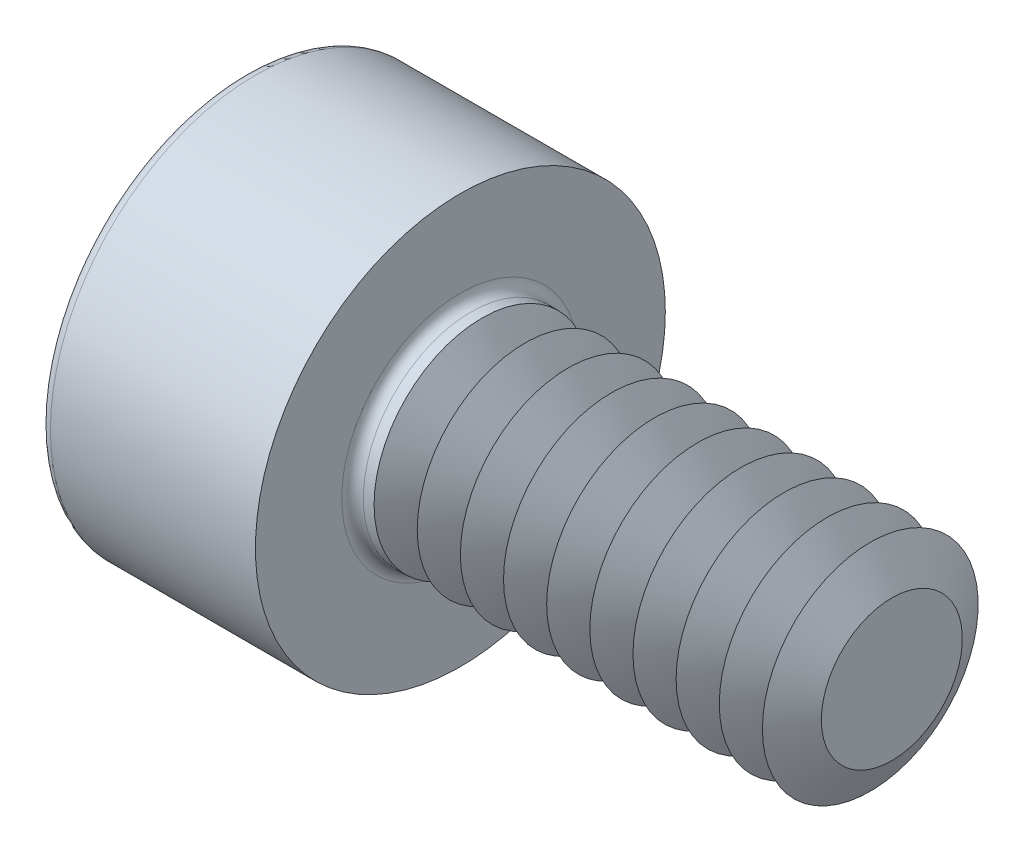
ISO-10303-21;
HEADER;
FILE_DESCRIPTION(('STEP AP214'),'2;1');
FILE_NAME('part.step','',(''),(''),'','','');
FILE_SCHEMA(('AUTOMOTIVE_DESIGN { 1 0 10303 214 1 1 1 1 }'));
ENDSEC;
DATA;
#1=APPLICATION_CONTEXT('core data for automotive mechanical design processes');
#2=APPLICATION_PROTOCOL_DEFINITION('international standard','automotive_design',2000,#1);
#3=PRODUCT_CONTEXT('',#1,'mechanical');
#4=PRODUCT('Part','Part','',(#3));
#5=PRODUCT_RELATED_PRODUCT_CATEGORY('part','',(#4));
#6=PRODUCT_DEFINITION_FORMATION('','',#4);
#7=PRODUCT_DEFINITION_CONTEXT('part definition',#1,'design');
#8=PRODUCT_DEFINITION('design','',#6,#7);
#9=PRODUCT_DEFINITION_SHAPE('','',#8);
#10=(LENGTH_UNIT() NAMED_UNIT(*) SI_UNIT(.MILLI.,.METRE.));
#11=(NAMED_UNIT(*) PLANE_ANGLE_UNIT() SI_UNIT($,.RADIAN.));
#12=(NAMED_UNIT(*) SI_UNIT($,.STERADIAN.) SOLID_ANGLE_UNIT());
#13=UNCERTAINTY_MEASURE_WITH_UNIT(LENGTH_MEASURE(1.E-05),#10,'distance_accuracy_value','');
#14=(GEOMETRIC_REPRESENTATION_CONTEXT(3) GLOBAL_UNCERTAINTY_ASSIGNED_CONTEXT((#13)) GLOBAL_UNIT_ASSIGNED_CONTEXT((#10,
#11,#12)) REPRESENTATION_CONTEXT('',''));
#15=CARTESIAN_POINT('',(0.,0.,0.));
#16=DIRECTION('',(0.,0.,1.));
#17=DIRECTION('',(1.,0.,0.));
#18=AXIS2_PLACEMENT_3D('',#15,#16,#17);
#19=CARTESIAN_POINT('',(4.2,0.,0.));
#20=DIRECTION('',(-1.,0.,0.));
#21=DIRECTION('',(0.,0.,1.));
#22=AXIS2_PLACEMENT_3D('',#19,#20,#21);
#23=CONICAL_SURFACE('',#22,1.,1.04718484902493);
#24=CARTESIAN_POINT('',(4.4,0.,0.));
#25=DIRECTION('',(-1.,0.,0.));
#26=DIRECTION('',(0.,0.,1.));
#27=AXIS2_PLACEMENT_3D('',#24,#25,#26);
#28=CIRCLE('',#27,0.6536);
#29=CARTESIAN_POINT('',(4.4,0.,0.6536));
#30=VERTEX_POINT('',#29);
#31=EDGE_CURVE('E308',#30,#30,#28,.T.);
#32=ORIENTED_EDGE('',*,*,#31,.T.);
#33=EDGE_LOOP('',(#32));
#34=FACE_BOUND('',#33,.T.);
#35=CARTESIAN_POINT('',(4.2,0.,0.));
#36=DIRECTION('',(-1.,0.,0.));
#37=DIRECTION('',(0.,0.,1.));
#38=AXIS2_PLACEMENT_3D('',#35,#36,#37);
#39=CIRCLE('',#38,1.);
#40=CARTESIAN_POINT('',(4.2,0.,1.));
#41=VERTEX_POINT('',#40);
#42=EDGE_CURVE('E299',#41,#41,#39,.T.);
#43=ORIENTED_EDGE('',*,*,#42,.F.);
#44=EDGE_LOOP('',(#43));
#45=FACE_BOUND('',#44,.T.);
#46=ADVANCED_FACE('F47',(#34,#45),#23,.T.);
#47=CARTESIAN_POINT('',(4.4,0.,0.));
#48=DIRECTION('',(1.,0.,0.));
#49=DIRECTION('',(0.,0.,-1.));
#50=AXIS2_PLACEMENT_3D('',#47,#48,#49);
#51=CONICAL_SURFACE('',#50,0.6536,1.04718484902493);
#52=CARTESIAN_POINT('',(4.6,0.,0.));
#53=DIRECTION('',(-1.,0.,0.));
#54=DIRECTION('',(0.,0.,1.));
#55=AXIS2_PLACEMENT_3D('',#52,#53,#54);
#56=CIRCLE('',#55,1.);
#57=CARTESIAN_POINT('',(4.6,0.,1.));
#58=VERTEX_POINT('',#57);
#59=EDGE_CURVE('E304',#58,#58,#56,.T.);
#60=ORIENTED_EDGE('',*,*,#59,.T.);
#61=EDGE_LOOP('',(#60));
#62=FACE_BOUND('',#61,.T.);
#63=ORIENTED_EDGE('',*,*,#31,.F.);
#64=EDGE_LOOP('',(#63));
#65=FACE_BOUND('',#64,.T.);
#66=ADVANCED_FACE('F187',(#62,#65),#51,.T.);
#67=CARTESIAN_POINT('',(6.,1.,0.));
#68=DIRECTION('',(1.,0.,0.));
#69=DIRECTION('',(0.,0.,-1.));
#70=AXIS2_PLACEMENT_3D('',#67,#68,#69);
#71=PLANE('',#70);
#72=CARTESIAN_POINT('',(6.,0.,0.));
#73=DIRECTION('',(-1.,0.,0.));
#74=DIRECTION('',(0.,0.,1.));
#75=AXIS2_PLACEMENT_3D('',#72,#73,#74);
#76=CIRCLE('',#75,0.6536);
#77=CARTESIAN_POINT('',(6.,0.,0.6536));
#78=VERTEX_POINT('',#77);
#79=EDGE_CURVE('E137',#78,#78,#76,.T.);
#80=ORIENTED_EDGE('',*,*,#79,.F.);
#81=EDGE_LOOP('',(#80));
#82=FACE_BOUND('',#81,.T.);
#83=ADVANCED_FACE('F192',(#82),#71,.T.);
#84=CARTESIAN_POINT('',(5.8,0.,0.));
#85=DIRECTION('',(-1.,0.,0.));
#86=DIRECTION('',(0.,0.,1.));
#87=AXIS2_PLACEMENT_3D('',#84,#85,#86);
#88=CONICAL_SURFACE('',#87,1.,1.04718484902493);
#89=ORIENTED_EDGE('',*,*,#79,.T.);
#90=EDGE_LOOP('',(#89));
#91=FACE_BOUND('',#90,.T.);
#92=CARTESIAN_POINT('',(5.8,0.,0.));
#93=DIRECTION('',(-1.,0.,0.));
#94=DIRECTION('',(0.,0.,1.));
#95=AXIS2_PLACEMENT_3D('',#92,#93,#94);
#96=CIRCLE('',#95,1.);
#97=CARTESIAN_POINT('',(5.8,0.,1.));
#98=VERTEX_POINT('',#97);
#99=EDGE_CURVE('E325',#98,#98,#96,.T.);
#100=ORIENTED_EDGE('',*,*,#99,.F.);
#101=EDGE_LOOP('',(#100));
#102=FACE_BOUND('',#101,.T.);
#103=ADVANCED_FACE('F222',(#91,#102),#88,.T.);
#104=CARTESIAN_POINT('',(5.6,0.,0.));
#105=DIRECTION('',(1.,0.,0.));
#106=DIRECTION('',(0.,0.,-1.));
#107=AXIS2_PLACEMENT_3D('',#104,#105,#106);
#108=CONICAL_SURFACE('',#107,0.6536,1.04718484902493);
#109=ORIENTED_EDGE('',*,*,#99,.T.);
#110=EDGE_LOOP('',(#109));
#111=FACE_BOUND('',#110,.T.);
#112=CARTESIAN_POINT('',(5.6,0.,0.));
#113=DIRECTION('',(-1.,0.,0.));
#114=DIRECTION('',(0.,0.,1.));
#115=AXIS2_PLACEMENT_3D('',#112,#113,#114);
#116=CIRCLE('',#115,0.6536);
#117=CARTESIAN_POINT('',(5.6,0.,0.6536));
#118=VERTEX_POINT('',#117);
#119=EDGE_CURVE('E324',#118,#118,#116,.T.);
#120=ORIENTED_EDGE('',*,*,#119,.F.);
#121=EDGE_LOOP('',(#120));
#122=FACE_BOUND('',#121,.T.);
#123=ADVANCED_FACE('F218',(#111,#122),#108,.T.);
#124=CARTESIAN_POINT('',(5.4,0.,0.));
#125=DIRECTION('',(-1.,0.,0.));
#126=DIRECTION('',(0.,0.,1.));
#127=AXIS2_PLACEMENT_3D('',#124,#125,#126);
#128=CONICAL_SURFACE('',#127,1.,1.04718484902493);
#129=ORIENTED_EDGE('',*,*,#119,.T.);
#130=EDGE_LOOP('',(#129));
#131=FACE_BOUND('',#130,.T.);
#132=CARTESIAN_POINT('',(5.4,0.,0.));
#133=DIRECTION('',(-1.,0.,0.));
#134=DIRECTION('',(0.,0.,1.));
#135=AXIS2_PLACEMENT_3D('',#132,#133,#134);
#136=CIRCLE('',#135,1.);
#137=CARTESIAN_POINT('',(5.4,0.,1.));
#138=VERTEX_POINT('',#137);
#139=EDGE_CURVE('E317',#138,#138,#136,.T.);
#140=ORIENTED_EDGE('',*,*,#139,.F.);
#141=EDGE_LOOP('',(#140));
#142=FACE_BOUND('',#141,.T.);
#143=ADVANCED_FACE('F212',(#131,#142),#128,.T.);
#144=CARTESIAN_POINT('',(5.2,0.,0.));
#145=DIRECTION('',(1.,0.,0.));
#146=DIRECTION('',(0.,0.,-1.));
#147=AXIS2_PLACEMENT_3D('',#144,#145,#146);
#148=CONICAL_SURFACE('',#147,0.6536,1.04718484902493);
#149=ORIENTED_EDGE('',*,*,#139,.T.);
#150=EDGE_LOOP('',(#149));
#151=FACE_BOUND('',#150,.T.);
#152=CARTESIAN_POINT('',(5.2,0.,0.));
#153=DIRECTION('',(-1.,0.,0.));
#154=DIRECTION('',(0.,0.,1.));
#155=AXIS2_PLACEMENT_3D('',#152,#153,#154);
#156=CIRCLE('',#155,0.6536);
#157=CARTESIAN_POINT('',(5.2,0.,0.6536));
#158=VERTEX_POINT('',#157);
#159=EDGE_CURVE('E316',#158,#158,#156,.T.);
#160=ORIENTED_EDGE('',*,*,#159,.F.);
#161=EDGE_LOOP('',(#160));
#162=FACE_BOUND('',#161,.T.);
#163=ADVANCED_FACE('F208',(#151,#162),#148,.T.);
#164=CARTESIAN_POINT('',(5.,0.,0.));
#165=DIRECTION('',(-1.,0.,0.));
#166=DIRECTION('',(0.,0.,1.));
#167=AXIS2_PLACEMENT_3D('',#164,#165,#166);
#168=CONICAL_SURFACE('',#167,1.,1.04718484902493);
#169=ORIENTED_EDGE('',*,*,#159,.T.);
#170=EDGE_LOOP('',(#169));
#171=FACE_BOUND('',#170,.T.);
#172=CARTESIAN_POINT('',(5.,0.,0.));
#173=DIRECTION('',(-1.,0.,0.));
#174=DIRECTION('',(0.,0.,1.));
#175=AXIS2_PLACEMENT_3D('',#172,#173,#174);
#176=CIRCLE('',#175,1.);
#177=CARTESIAN_POINT('',(5.,0.,1.));
#178=VERTEX_POINT('',#177);
#179=EDGE_CURVE('E309',#178,#178,#176,.T.);
#180=ORIENTED_EDGE('',*,*,#179,.F.);
#181=EDGE_LOOP('',(#180));
#182=FACE_BOUND('',#181,.T.);
#183=ADVANCED_FACE('F202',(#171,#182),#168,.T.);
#184=CARTESIAN_POINT('',(4.8,0.,0.));
#185=DIRECTION('',(1.,0.,0.));
#186=DIRECTION('',(0.,0.,-1.));
#187=AXIS2_PLACEMENT_3D('',#184,#185,#186);
#188=CONICAL_SURFACE('',#187,0.6536,1.04718484902493);
#189=ORIENTED_EDGE('',*,*,#179,.T.);
#190=EDGE_LOOP('',(#189));
#191=FACE_BOUND('',#190,.T.);
#192=CARTESIAN_POINT('',(4.8,0.,0.));
#193=DIRECTION('',(-1.,0.,0.));
#194=DIRECTION('',(0.,0.,1.));
#195=AXIS2_PLACEMENT_3D('',#192,#193,#194);
#196=CIRCLE('',#195,0.6536);
#197=CARTESIAN_POINT('',(4.8,0.,0.6536));
#198=VERTEX_POINT('',#197);
#199=EDGE_CURVE('E312',#198,#198,#196,.T.);
#200=ORIENTED_EDGE('',*,*,#199,.F.);
#201=EDGE_LOOP('',(#200));
#202=FACE_BOUND('',#201,.T.);
#203=ADVANCED_FACE('F196',(#191,#202),#188,.T.);
#204=CARTESIAN_POINT('',(4.6,0.,0.));
#205=DIRECTION('',(-1.,0.,0.));
#206=DIRECTION('',(0.,0.,1.));
#207=AXIS2_PLACEMENT_3D('',#204,#205,#206);
#208=CONICAL_SURFACE('',#207,1.,1.04718484902493);
#209=ORIENTED_EDGE('',*,*,#199,.T.);
#210=EDGE_LOOP('',(#209));
#211=FACE_BOUND('',#210,.T.);
#212=ORIENTED_EDGE('',*,*,#59,.F.);
#213=EDGE_LOOP('',(#212));
#214=FACE_BOUND('',#213,.T.);
#215=ADVANCED_FACE('F201',(#211,#214),#208,.T.);
#216=CARTESIAN_POINT('',(3.8,0.,0.));
#217=DIRECTION('',(-1.,0.,0.));
#218=DIRECTION('',(0.,0.,1.));
#219=AXIS2_PLACEMENT_3D('',#216,#217,#218);
#220=CONICAL_SURFACE('',#219,1.,1.04718484902493);
#221=CARTESIAN_POINT('',(4.,0.,0.));
#222=DIRECTION('',(-1.,0.,0.));
#223=DIRECTION('',(0.,0.,1.));
#224=AXIS2_PLACEMENT_3D('',#221,#222,#223);
#225=CIRCLE('',#224,0.6536);
#226=CARTESIAN_POINT('',(4.,0.,0.6536));
#227=VERTEX_POINT('',#226);
#228=EDGE_CURVE('E305',#227,#227,#225,.T.);
#229=ORIENTED_EDGE('',*,*,#228,.T.);
#230=EDGE_LOOP('',(#229));
#231=FACE_BOUND('',#230,.T.);
#232=CARTESIAN_POINT('',(3.8,0.,0.));
#233=DIRECTION('',(-1.,0.,0.));
#234=DIRECTION('',(0.,0.,1.));
#235=AXIS2_PLACEMENT_3D('',#232,#233,#234);
#236=CIRCLE('',#235,1.);
#237=CARTESIAN_POINT('',(3.8,0.,1.));
#238=VERTEX_POINT('',#237);
#239=EDGE_CURVE('E291',#238,#238,#236,.T.);
#240=ORIENTED_EDGE('',*,*,#239,.F.);
#241=EDGE_LOOP('',(#240));
#242=FACE_BOUND('',#241,.T.);
#243=ADVANCED_FACE('F206',(#231,#242),#220,.T.);
#244=CARTESIAN_POINT('',(4.,0.,0.));
#245=DIRECTION('',(1.,0.,0.));
#246=DIRECTION('',(0.,0.,-1.));
#247=AXIS2_PLACEMENT_3D('',#244,#245,#246);
#248=CONICAL_SURFACE('',#247,0.6536,1.04718484902493);
#249=ORIENTED_EDGE('',*,*,#42,.T.);
#250=EDGE_LOOP('',(#249));
#251=FACE_BOUND('',#250,.T.);
#252=ORIENTED_EDGE('',*,*,#228,.F.);
#253=EDGE_LOOP('',(#252));
#254=FACE_BOUND('',#253,.T.);
#255=ADVANCED_FACE('F446',(#251,#254),#248,.T.);
#256=CARTESIAN_POINT('',(3.4,0.,0.));
#257=DIRECTION('',(-1.,0.,0.));
#258=DIRECTION('',(0.,0.,1.));
#259=AXIS2_PLACEMENT_3D('',#256,#257,#258);
#260=CONICAL_SURFACE('',#259,1.,1.04718484902493);
#261=CARTESIAN_POINT('',(3.6,0.,0.));
#262=DIRECTION('',(-1.,0.,0.));
#263=DIRECTION('',(0.,0.,1.));
#264=AXIS2_PLACEMENT_3D('',#261,#262,#263);
#265=CIRCLE('',#264,0.6536);
#266=CARTESIAN_POINT('',(3.6,0.,0.6536));
#267=VERTEX_POINT('',#266);
#268=EDGE_CURVE('E298',#267,#267,#265,.T.);
#269=ORIENTED_EDGE('',*,*,#268,.T.);
#270=EDGE_LOOP('',(#269));
#271=FACE_BOUND('',#270,.T.);
#272=CARTESIAN_POINT('',(3.4,0.,0.));
#273=DIRECTION('',(-1.,0.,0.));
#274=DIRECTION('',(0.,0.,1.));
#275=AXIS2_PLACEMENT_3D('',#272,#273,#274);
#276=CIRCLE('',#275,1.);
#277=CARTESIAN_POINT('',(3.4,0.,1.));
#278=VERTEX_POINT('',#277);
#279=EDGE_CURVE('E289',#278,#278,#276,.T.);
#280=ORIENTED_EDGE('',*,*,#279,.F.);
#281=EDGE_LOOP('',(#280));
#282=FACE_BOUND('',#281,.T.);
#283=ADVANCED_FACE('F439',(#271,#282),#260,.T.);
#284=CARTESIAN_POINT('',(3.6,0.,0.));
#285=DIRECTION('',(1.,0.,0.));
#286=DIRECTION('',(0.,0.,-1.));
#287=AXIS2_PLACEMENT_3D('',#284,#285,#286);
#288=CONICAL_SURFACE('',#287,0.6536,1.04718484902493);
#289=ORIENTED_EDGE('',*,*,#239,.T.);
#290=EDGE_LOOP('',(#289));
#291=FACE_BOUND('',#290,.T.);
#292=ORIENTED_EDGE('',*,*,#268,.F.);
#293=EDGE_LOOP('',(#292));
#294=FACE_BOUND('',#293,.T.);
#295=ADVANCED_FACE('F431',(#291,#294),#288,.T.);
#296=CARTESIAN_POINT('',(3.,0.,0.));
#297=DIRECTION('',(-1.,0.,0.));
#298=DIRECTION('',(0.,0.,1.));
#299=AXIS2_PLACEMENT_3D('',#296,#297,#298);
#300=CONICAL_SURFACE('',#299,1.,1.04718484902493);
#301=CARTESIAN_POINT('',(3.2,0.,0.));
#302=DIRECTION('',(-1.,0.,0.));
#303=DIRECTION('',(0.,0.,1.));
#304=AXIS2_PLACEMENT_3D('',#301,#302,#303);
#305=CIRCLE('',#304,0.6536);
#306=CARTESIAN_POINT('',(3.2,0.,0.6536));
#307=VERTEX_POINT('',#306);
#308=EDGE_CURVE('E288',#307,#307,#305,.T.);
#309=ORIENTED_EDGE('',*,*,#308,.T.);
#310=EDGE_LOOP('',(#309));
#311=FACE_BOUND('',#310,.T.);
#312=CARTESIAN_POINT('',(3.,0.,0.));
#313=DIRECTION('',(-1.,0.,0.));
#314=DIRECTION('',(0.,0.,1.));
#315=AXIS2_PLACEMENT_3D('',#312,#313,#314);
#316=CIRCLE('',#315,1.);
#317=CARTESIAN_POINT('',(3.,0.,1.));
#318=VERTEX_POINT('',#317);
#319=EDGE_CURVE('E282',#318,#318,#316,.T.);
#320=ORIENTED_EDGE('',*,*,#319,.F.);
#321=EDGE_LOOP('',(#320));
#322=FACE_BOUND('',#321,.T.);
#323=ADVANCED_FACE('F422',(#311,#322),#300,.T.);
#324=CARTESIAN_POINT('',(3.2,0.,0.));
#325=DIRECTION('',(1.,0.,0.));
#326=DIRECTION('',(0.,0.,-1.));
#327=AXIS2_PLACEMENT_3D('',#324,#325,#326);
#328=CONICAL_SURFACE('',#327,0.6536,1.04718484902493);
#329=ORIENTED_EDGE('',*,*,#279,.T.);
#330=EDGE_LOOP('',(#329));
#331=FACE_BOUND('',#330,.T.);
#332=ORIENTED_EDGE('',*,*,#308,.F.);
#333=EDGE_LOOP('',(#332));
#334=FACE_BOUND('',#333,.T.);
#335=ADVANCED_FACE('F413',(#331,#334),#328,.T.);
#336=CARTESIAN_POINT('',(2.6,0.,0.));
#337=DIRECTION('',(-1.,0.,0.));
#338=DIRECTION('',(0.,0.,1.));
#339=AXIS2_PLACEMENT_3D('',#336,#337,#338);
#340=CONICAL_SURFACE('',#339,1.,1.04718484902493);
#341=CARTESIAN_POINT('',(2.8,0.,0.));
#342=DIRECTION('',(-1.,0.,0.));
#343=DIRECTION('',(0.,0.,1.));
#344=AXIS2_PLACEMENT_3D('',#341,#342,#343);
#345=CIRCLE('',#344,0.6536);
#346=CARTESIAN_POINT('',(2.8,0.,0.6536));
#347=VERTEX_POINT('',#346);
#348=EDGE_CURVE('E284',#347,#347,#345,.T.);
#349=ORIENTED_EDGE('',*,*,#348,.T.);
#350=EDGE_LOOP('',(#349));
#351=FACE_BOUND('',#350,.T.);
#352=CARTESIAN_POINT('',(2.6,0.,0.));
#353=DIRECTION('',(-1.,0.,0.));
#354=DIRECTION('',(0.,0.,1.));
#355=AXIS2_PLACEMENT_3D('',#352,#353,#354);
#356=CIRCLE('',#355,1.);
#357=CARTESIAN_POINT('',(2.6,0.,1.));
#358=VERTEX_POINT('',#357);
#359=EDGE_CURVE('E271',#358,#358,#356,.T.);
#360=ORIENTED_EDGE('',*,*,#359,.F.);
#361=EDGE_LOOP('',(#360));
#362=FACE_BOUND('',#361,.T.);
#363=ADVANCED_FACE('F404',(#351,#362),#340,.T.);
#364=CARTESIAN_POINT('',(2.8,0.,0.));
#365=DIRECTION('',(1.,0.,0.));
#366=DIRECTION('',(0.,0.,-1.));
#367=AXIS2_PLACEMENT_3D('',#364,#365,#366);
#368=CONICAL_SURFACE('',#367,0.6536,1.04718484902493);
#369=ORIENTED_EDGE('',*,*,#319,.T.);
#370=EDGE_LOOP('',(#369));
#371=FACE_BOUND('',#370,.T.);
#372=ORIENTED_EDGE('',*,*,#348,.F.);
#373=EDGE_LOOP('',(#372));
#374=FACE_BOUND('',#373,.T.);
#375=ADVANCED_FACE('F391',(#371,#374),#368,.T.);
#376=CARTESIAN_POINT('',(2.2,0.,0.));
#377=DIRECTION('',(-1.,0.,0.));
#378=DIRECTION('',(0.,0.,1.));
#379=AXIS2_PLACEMENT_3D('',#376,#377,#378);
#380=CONICAL_SURFACE('',#379,1.,1.04718484902493);
#381=CARTESIAN_POINT('',(2.4,0.,0.));
#382=DIRECTION('',(-1.,0.,0.));
#383=DIRECTION('',(0.,0.,1.));
#384=AXIS2_PLACEMENT_3D('',#381,#382,#383);
#385=CIRCLE('',#384,0.6536);
#386=CARTESIAN_POINT('',(2.4,0.,0.6536));
#387=VERTEX_POINT('',#386);
#388=EDGE_CURVE('E276',#387,#387,#385,.T.);
#389=ORIENTED_EDGE('',*,*,#388,.T.);
#390=EDGE_LOOP('',(#389));
#391=FACE_BOUND('',#390,.T.);
#392=CARTESIAN_POINT('',(2.2,0.,0.));
#393=DIRECTION('',(-1.,0.,0.));
#394=DIRECTION('',(0.,0.,1.));
#395=AXIS2_PLACEMENT_3D('',#392,#393,#394);
#396=CIRCLE('',#395,1.);
#397=CARTESIAN_POINT('',(2.2,0.,1.));
#398=VERTEX_POINT('',#397);
#399=EDGE_CURVE('E272',#398,#398,#396,.T.);
#400=ORIENTED_EDGE('',*,*,#399,.F.);
#401=EDGE_LOOP('',(#400));
#402=FACE_BOUND('',#401,.T.);
#403=ADVANCED_FACE('F386',(#391,#402),#380,.T.);
#404=CARTESIAN_POINT('',(2.4,0.,0.));
#405=DIRECTION('',(1.,0.,0.));
#406=DIRECTION('',(0.,0.,-1.));
#407=AXIS2_PLACEMENT_3D('',#404,#405,#406);
#408=CONICAL_SURFACE('',#407,0.6536,1.04718484902493);
#409=ORIENTED_EDGE('',*,*,#359,.T.);
#410=EDGE_LOOP('',(#409));
#411=FACE_BOUND('',#410,.T.);
#412=ORIENTED_EDGE('',*,*,#388,.F.);
#413=EDGE_LOOP('',(#412));
#414=FACE_BOUND('',#413,.T.);
#415=ADVANCED_FACE('F233',(#411,#414),#408,.T.);
#416=CARTESIAN_POINT('',(1.,-0.4325,0.749111974273539));
#417=DIRECTION('',(-1.,0.,0.));
#418=DIRECTION('',(0.,0.,1.));
#419=AXIS2_PLACEMENT_3D('',#416,#417,#418);
#420=PLANE('',#419);
#421=DIRECTION('',(0.,0.5,0.866025403784439));
#422=VECTOR('',#421,1.);
#423=CARTESIAN_POINT('',(1.,-0.865,0.));
#424=LINE('',#423,#422);
#425=CARTESIAN_POINT('',(1.,-0.865,0.));
#426=VERTEX_POINT('',#425);
#427=CARTESIAN_POINT('',(1.,-0.432500000000001,0.749111974273539));
#428=VERTEX_POINT('',#427);
#429=EDGE_CURVE('E149',#426,#428,#424,.T.);
#430=ORIENTED_EDGE('',*,*,#429,.T.);
#431=DIRECTION('',(0.,1.,0.));
#432=VECTOR('',#431,1.);
#433=CARTESIAN_POINT('',(1.,-0.432500000000001,0.749111974273539));
#434=LINE('',#433,#432);
#435=CARTESIAN_POINT('',(1.,0.432499999999999,0.749111974273539));
#436=VERTEX_POINT('',#435);
#437=EDGE_CURVE('E135',#428,#436,#434,.T.);
#438=ORIENTED_EDGE('',*,*,#437,.T.);
#439=DIRECTION('',(0.,0.5,-0.866025403784439));
#440=VECTOR('',#439,1.);
#441=CARTESIAN_POINT('',(1.,0.432499999999999,0.749111974273539));
#442=LINE('',#441,#440);
#443=CARTESIAN_POINT('',(1.,0.864999999999999,0.));
#444=VERTEX_POINT('',#443);
#445=EDGE_CURVE('E129',#436,#444,#442,.T.);
#446=ORIENTED_EDGE('',*,*,#445,.T.);
#447=DIRECTION('',(0.,-0.499999999999999,-0.866025403784439));
#448=VECTOR('',#447,1.);
#449=CARTESIAN_POINT('',(1.,0.864999999999999,0.));
#450=LINE('',#449,#448);
#451=CARTESIAN_POINT('',(1.,0.4325,-0.74911197427354));
#452=VERTEX_POINT('',#451);
#453=EDGE_CURVE('E107',#444,#452,#450,.T.);
#454=ORIENTED_EDGE('',*,*,#453,.T.);
#455=DIRECTION('',(0.,-1.,0.));
#456=VECTOR('',#455,1.);
#457=CARTESIAN_POINT('',(1.,0.4325,-0.74911197427354));
#458=LINE('',#457,#456);
#459=CARTESIAN_POINT('',(1.,-0.432500000000001,-0.74911197427354));
#460=VERTEX_POINT('',#459);
#461=EDGE_CURVE('E119',#452,#460,#458,.T.);
#462=ORIENTED_EDGE('',*,*,#461,.T.);
#463=DIRECTION('',(0.,-0.5,0.866025403784439));
#464=VECTOR('',#463,1.);
#465=CARTESIAN_POINT('',(1.,-0.432500000000001,-0.74911197427354));
#466=LINE('',#465,#464);
#467=EDGE_CURVE('E121',#460,#426,#466,.T.);
#468=ORIENTED_EDGE('',*,*,#467,.T.);
#469=EDGE_LOOP('',(#430,#438,#446,#454,#462,#468));
#470=FACE_BOUND('',#469,.T.);
#471=ADVANCED_FACE('F130',(#470),#420,.T.);
#472=CARTESIAN_POINT('',(1.,-0.432500000000001,0.749111974273539));
#473=DIRECTION('',(0.,0.,1.));
#474=DIRECTION('',(1.,0.,0.));
#475=AXIS2_PLACEMENT_3D('',#472,#473,#474);
#476=PLANE('',#475);
#477=DIRECTION('',(0.,1.,0.));
#478=VECTOR('',#477,1.);
#479=CARTESIAN_POINT('',(0.,-0.432500000000001,0.749111974273539));
#480=LINE('',#479,#478);
#481=CARTESIAN_POINT('',(0.,-0.432500000000001,0.749111974273539));
#482=VERTEX_POINT('',#481);
#483=CARTESIAN_POINT('',(0.,0.432499999999999,0.749111974273539));
#484=VERTEX_POINT('',#483);
#485=EDGE_CURVE('E136',#482,#484,#480,.T.);
#486=ORIENTED_EDGE('',*,*,#485,.T.);
#487=DIRECTION('',(-1.,0.,0.));
#488=VECTOR('',#487,1.);
#489=CARTESIAN_POINT('',(1.,0.432499999999999,0.749111974273539));
#490=LINE('',#489,#488);
#491=EDGE_CURVE('E151',#436,#484,#490,.T.);
#492=ORIENTED_EDGE('',*,*,#491,.F.);
#493=ORIENTED_EDGE('',*,*,#437,.F.);
#494=DIRECTION('',(-1.,0.,0.));
#495=VECTOR('',#494,1.);
#496=CARTESIAN_POINT('',(1.,-0.432500000000001,0.749111974273539));
#497=LINE('',#496,#495);
#498=EDGE_CURVE('E91',#428,#482,#497,.T.);
#499=ORIENTED_EDGE('',*,*,#498,.T.);
#500=EDGE_LOOP('',(#486,#492,#493,#499));
#501=FACE_BOUND('',#500,.T.);
#502=ADVANCED_FACE('F229',(#501),#476,.F.);
#503=CARTESIAN_POINT('',(1.,0.432499999999999,0.749111974273539));
#504=DIRECTION('',(0.,0.866025403784439,0.5));
#505=DIRECTION('',(0.,-0.5,0.866025403784439));
#506=AXIS2_PLACEMENT_3D('',#503,#504,#505);
#507=PLANE('',#506);
#508=DIRECTION('',(0.,0.5,-0.866025403784439));
#509=VECTOR('',#508,1.);
#510=CARTESIAN_POINT('',(0.,0.432499999999999,0.749111974273539));
#511=LINE('',#510,#509);
#512=CARTESIAN_POINT('',(0.,0.864999999999999,0.));
#513=VERTEX_POINT('',#512);
#514=EDGE_CURVE('E145',#484,#513,#511,.T.);
#515=ORIENTED_EDGE('',*,*,#514,.T.);
#516=DIRECTION('',(-1.,0.,0.));
#517=VECTOR('',#516,1.);
#518=CARTESIAN_POINT('',(1.,0.864999999999999,0.));
#519=LINE('',#518,#517);
#520=EDGE_CURVE('E120',#444,#513,#519,.T.);
#521=ORIENTED_EDGE('',*,*,#520,.F.);
#522=ORIENTED_EDGE('',*,*,#445,.F.);
#523=ORIENTED_EDGE('',*,*,#491,.T.);
#524=EDGE_LOOP('',(#515,#521,#522,#523));
#525=FACE_BOUND('',#524,.T.);
#526=ADVANCED_FACE('F237',(#525),#507,.F.);
#527=CARTESIAN_POINT('',(1.,0.864999999999999,0.));
#528=DIRECTION('',(0.,0.866025403784439,-0.499999999999999));
#529=DIRECTION('',(0.,0.499999999999999,0.866025403784439));
#530=AXIS2_PLACEMENT_3D('',#527,#528,#529);
#531=PLANE('',#530);
#532=DIRECTION('',(0.,-0.499999999999999,-0.866025403784439));
#533=VECTOR('',#532,1.);
#534=CARTESIAN_POINT('',(0.,0.864999999999999,0.));
#535=LINE('',#534,#533);
#536=CARTESIAN_POINT('',(0.,0.4325,-0.74911197427354));
#537=VERTEX_POINT('',#536);
#538=EDGE_CURVE('E115',#513,#537,#535,.T.);
#539=ORIENTED_EDGE('',*,*,#538,.T.);
#540=DIRECTION('',(-1.,0.,0.));
#541=VECTOR('',#540,1.);
#542=CARTESIAN_POINT('',(1.,0.4325,-0.74911197427354));
#543=LINE('',#542,#541);
#544=EDGE_CURVE('E102',#452,#537,#543,.T.);
#545=ORIENTED_EDGE('',*,*,#544,.F.);
#546=ORIENTED_EDGE('',*,*,#453,.F.);
#547=ORIENTED_EDGE('',*,*,#520,.T.);
#548=EDGE_LOOP('',(#539,#545,#546,#547));
#549=FACE_BOUND('',#548,.T.);
#550=ADVANCED_FACE('F110',(#549),#531,.F.);
#551=CARTESIAN_POINT('',(1.,0.4325,-0.74911197427354));
#552=DIRECTION('',(0.,0.,-1.));
#553=DIRECTION('',(-1.,0.,0.));
#554=AXIS2_PLACEMENT_3D('',#551,#552,#553);
#555=PLANE('',#554);
#556=DIRECTION('',(0.,-1.,0.));
#557=VECTOR('',#556,1.);
#558=CARTESIAN_POINT('',(0.,0.4325,-0.74911197427354));
#559=LINE('',#558,#557);
#560=CARTESIAN_POINT('',(0.,-0.432500000000001,-0.74911197427354));
#561=VERTEX_POINT('',#560);
#562=EDGE_CURVE('E146',#537,#561,#559,.T.);
#563=ORIENTED_EDGE('',*,*,#562,.T.);
#564=DIRECTION('',(-1.,0.,0.));
#565=VECTOR('',#564,1.);
#566=CARTESIAN_POINT('',(1.,-0.432500000000001,-0.74911197427354));
#567=LINE('',#566,#565);
#568=EDGE_CURVE('E116',#460,#561,#567,.T.);
#569=ORIENTED_EDGE('',*,*,#568,.F.);
#570=ORIENTED_EDGE('',*,*,#461,.F.);
#571=ORIENTED_EDGE('',*,*,#544,.T.);
#572=EDGE_LOOP('',(#563,#569,#570,#571));
#573=FACE_BOUND('',#572,.T.);
#574=ADVANCED_FACE('F122',(#573),#555,.F.);
#575=CARTESIAN_POINT('',(1.,-0.432500000000001,-0.74911197427354));
#576=DIRECTION('',(0.,-0.866025403784439,-0.5));
#577=DIRECTION('',(0.,0.5,-0.866025403784439));
#578=AXIS2_PLACEMENT_3D('',#575,#576,#577);
#579=PLANE('',#578);
#580=DIRECTION('',(0.,-0.5,0.866025403784439));
#581=VECTOR('',#580,1.);
#582=CARTESIAN_POINT('',(0.,-0.432500000000001,-0.74911197427354));
#583=LINE('',#582,#581);
#584=CARTESIAN_POINT('',(0.,-0.865,0.));
#585=VERTEX_POINT('',#584);
#586=EDGE_CURVE('E147',#561,#585,#583,.T.);
#587=ORIENTED_EDGE('',*,*,#586,.T.);
#588=DIRECTION('',(-1.,0.,0.));
#589=VECTOR('',#588,1.);
#590=CARTESIAN_POINT('',(1.,-0.865,0.));
#591=LINE('',#590,#589);
#592=EDGE_CURVE('E75',#426,#585,#591,.T.);
#593=ORIENTED_EDGE('',*,*,#592,.F.);
#594=ORIENTED_EDGE('',*,*,#467,.F.);
#595=ORIENTED_EDGE('',*,*,#568,.T.);
#596=EDGE_LOOP('',(#587,#593,#594,#595));
#597=FACE_BOUND('',#596,.T.);
#598=ADVANCED_FACE('F235',(#597),#579,.F.);
#599=CARTESIAN_POINT('',(1.,-0.865,0.));
#600=DIRECTION('',(0.,-0.866025403784439,0.5));
#601=DIRECTION('',(0.,-0.5,-0.866025403784439));
#602=AXIS2_PLACEMENT_3D('',#599,#600,#601);
#603=PLANE('',#602);
#604=DIRECTION('',(0.,0.5,0.866025403784439));
#605=VECTOR('',#604,1.);
#606=CARTESIAN_POINT('',(0.,-0.865,0.));
#607=LINE('',#606,#605);
#608=EDGE_CURVE('E63',#585,#482,#607,.T.);
#609=ORIENTED_EDGE('',*,*,#608,.T.);
#610=ORIENTED_EDGE('',*,*,#498,.F.);
#611=ORIENTED_EDGE('',*,*,#429,.F.);
#612=ORIENTED_EDGE('',*,*,#592,.T.);
#613=EDGE_LOOP('',(#609,#610,#611,#612));
#614=FACE_BOUND('',#613,.T.);
#615=ADVANCED_FACE('F185',(#614),#603,.F.);
#616=CARTESIAN_POINT('',(0.,0.,0.));
#617=DIRECTION('',(-1.,0.,0.));
#618=DIRECTION('',(0.,0.,1.));
#619=AXIS2_PLACEMENT_3D('',#616,#617,#618);
#620=PLANE('',#619);
#621=CARTESIAN_POINT('',(0.,0.,0.));
#622=DIRECTION('',(-1.,0.,0.));
#623=DIRECTION('',(0.,0.,1.));
#624=AXIS2_PLACEMENT_3D('',#621,#622,#623);
#625=CIRCLE('',#624,1.8);
#626=CARTESIAN_POINT('',(0.,0.,1.8));
#627=VERTEX_POINT('',#626);
#628=EDGE_CURVE('E11',#627,#627,#625,.T.);
#629=ORIENTED_EDGE('',*,*,#628,.T.);
#630=EDGE_LOOP('',(#629));
#631=FACE_BOUND('',#630,.T.);
#632=ORIENTED_EDGE('',*,*,#608,.F.);
#633=ORIENTED_EDGE('',*,*,#586,.F.);
#634=ORIENTED_EDGE('',*,*,#562,.F.);
#635=ORIENTED_EDGE('',*,*,#538,.F.);
#636=ORIENTED_EDGE('',*,*,#514,.F.);
#637=ORIENTED_EDGE('',*,*,#485,.F.);
#638=EDGE_LOOP('',(#632,#633,#634,#635,#636,#637));
#639=FACE_BOUND('',#638,.T.);
#640=ADVANCED_FACE('F173',(#631,#639),#620,.T.);
#641=CARTESIAN_POINT('',(0.1,0.,0.));
#642=DIRECTION('',(-1.,0.,0.));
#643=DIRECTION('',(0.,0.,1.));
#644=AXIS2_PLACEMENT_3D('',#641,#642,#643);
#645=TOROIDAL_SURFACE('',#644,1.8,0.1);
#646=ORIENTED_EDGE('',*,*,#628,.F.);
#647=EDGE_LOOP('',(#646));
#648=FACE_BOUND('',#647,.T.);
#649=CARTESIAN_POINT('',(0.1,0.,0.));
#650=DIRECTION('',(-1.,0.,0.));
#651=DIRECTION('',(0.,0.,1.));
#652=AXIS2_PLACEMENT_3D('',#649,#650,#651);
#653=CIRCLE('',#652,1.9);
#654=CARTESIAN_POINT('',(0.1,0.,1.9));
#655=VERTEX_POINT('',#654);
#656=EDGE_CURVE('E60',#655,#655,#653,.F.);
#657=ORIENTED_EDGE('',*,*,#656,.F.);
#658=EDGE_LOOP('',(#657));
#659=FACE_BOUND('',#658,.T.);
#660=ADVANCED_FACE('F51',(#648,#659),#645,.T.);
#661=CARTESIAN_POINT('',(0.,0.,0.));
#662=DIRECTION('',(1.,0.,0.));
#663=DIRECTION('',(0.,0.,-1.));
#664=AXIS2_PLACEMENT_3D('',#661,#662,#663);
#665=CYLINDRICAL_SURFACE('',#664,1.9);
#666=ORIENTED_EDGE('',*,*,#656,.T.);
#667=EDGE_LOOP('',(#666));
#668=FACE_BOUND('',#667,.T.);
#669=CARTESIAN_POINT('',(2.,0.,0.));
#670=DIRECTION('',(1.,0.,0.));
#671=DIRECTION('',(0.,0.,-1.));
#672=AXIS2_PLACEMENT_3D('',#669,#670,#671);
#673=CIRCLE('',#672,1.9);
#674=CARTESIAN_POINT('',(2.,0.,-1.9));
#675=VERTEX_POINT('',#674);
#676=EDGE_CURVE('E161',#675,#675,#673,.T.);
#677=ORIENTED_EDGE('',*,*,#676,.F.);
#678=EDGE_LOOP('',(#677));
#679=FACE_BOUND('',#678,.T.);
#680=ADVANCED_FACE('F169',(#668,#679),#665,.T.);
#681=CARTESIAN_POINT('',(2.,1.9,0.));
#682=DIRECTION('',(1.,0.,0.));
#683=DIRECTION('',(0.,0.,-1.));
#684=AXIS2_PLACEMENT_3D('',#681,#682,#683);
#685=PLANE('',#684);
#686=ORIENTED_EDGE('',*,*,#676,.T.);
#687=EDGE_LOOP('',(#686));
#688=FACE_BOUND('',#687,.T.);
#689=CARTESIAN_POINT('',(2.,0.,0.));
#690=DIRECTION('',(1.,0.,0.));
#691=DIRECTION('',(0.,0.,-1.));
#692=AXIS2_PLACEMENT_3D('',#689,#690,#691);
#693=CIRCLE('',#692,1.1);
#694=CARTESIAN_POINT('',(2.,0.,-1.1));
#695=VERTEX_POINT('',#694);
#696=EDGE_CURVE('E158',#695,#695,#693,.T.);
#697=ORIENTED_EDGE('',*,*,#696,.F.);
#698=EDGE_LOOP('',(#697));
#699=FACE_BOUND('',#698,.T.);
#700=ADVANCED_FACE('F177',(#688,#699),#685,.T.);
#701=CARTESIAN_POINT('',(2.1,0.,0.));
#702=DIRECTION('',(1.,0.,0.));
#703=DIRECTION('',(0.,0.,-1.));
#704=AXIS2_PLACEMENT_3D('',#701,#702,#703);
#705=TOROIDAL_SURFACE('',#704,1.1,0.1);
#706=ORIENTED_EDGE('',*,*,#696,.T.);
#707=EDGE_LOOP('',(#706));
#708=FACE_BOUND('',#707,.T.);
#709=CARTESIAN_POINT('',(2.1,0.,0.));
#710=DIRECTION('',(1.,0.,0.));
#711=DIRECTION('',(0.,0.,-1.));
#712=AXIS2_PLACEMENT_3D('',#709,#710,#711);
#713=CIRCLE('',#712,1.);
#714=CARTESIAN_POINT('',(2.1,0.,-1.));
#715=VERTEX_POINT('',#714);
#716=EDGE_CURVE('E155',#715,#715,#713,.T.);
#717=ORIENTED_EDGE('',*,*,#716,.F.);
#718=EDGE_LOOP('',(#717));
#719=FACE_BOUND('',#718,.T.);
#720=ADVANCED_FACE('F251',(#708,#719),#705,.F.);
#721=CARTESIAN_POINT('',(0.,0.,0.));
#722=DIRECTION('',(1.,0.,0.));
#723=DIRECTION('',(0.,0.,-1.));
#724=AXIS2_PLACEMENT_3D('',#721,#722,#723);
#725=CYLINDRICAL_SURFACE('',#724,1.);
#726=ORIENTED_EDGE('',*,*,#716,.T.);
#727=EDGE_LOOP('',(#726));
#728=FACE_BOUND('',#727,.T.);
#729=ORIENTED_EDGE('',*,*,#399,.T.);
#730=EDGE_LOOP('',(#729));
#731=FACE_BOUND('',#730,.T.);
#732=ADVANCED_FACE('F252',(#728,#731),#725,.T.);
#733=CLOSED_SHELL('',(#46,#66,#83,#103,#123,#143,#163,#183,#203,#215,#243,#255,#283,#295,#323,
#335,#363,#375,#403,#415,#471,#502,#526,#550,#574,#598,#615,#640,#660,#680,#700,#720,#732));
#734=MANIFOLD_SOLID_BREP('B2',#733);
#735=ADVANCED_BREP_SHAPE_REPRESENTATION('',(#18,#734),#14);
#736=SHAPE_DEFINITION_REPRESENTATION(#9,#735);
ENDSEC;
END-ISO-10303-21;
